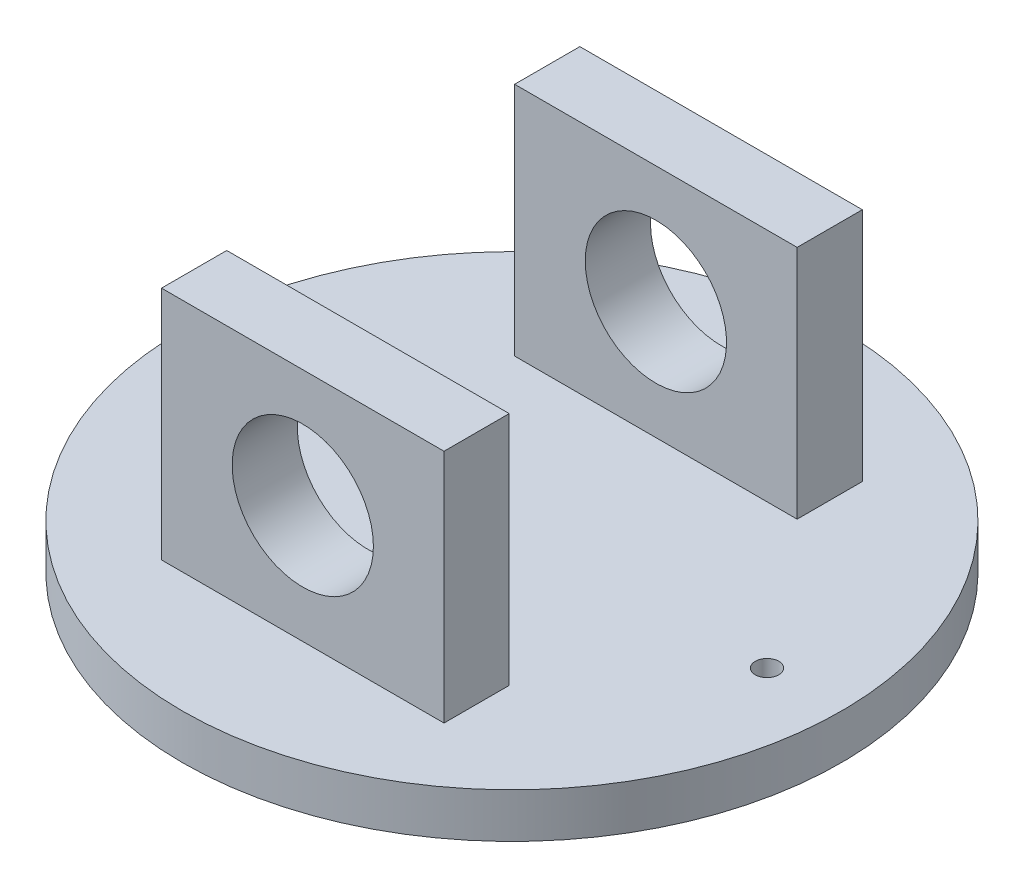
ISO-10303-21;
HEADER;
FILE_DESCRIPTION(('STEP AP214'),'2;1');
FILE_NAME('part.step','',(''),(''),'','','');
FILE_SCHEMA(('AUTOMOTIVE_DESIGN { 1 0 10303 214 1 1 1 1 }'));
ENDSEC;
DATA;
#1=APPLICATION_CONTEXT('core data for automotive mechanical design processes');
#2=APPLICATION_PROTOCOL_DEFINITION('international standard','automotive_design',2000,#1);
#3=PRODUCT_CONTEXT('',#1,'mechanical');
#4=PRODUCT('Part','Part','',(#3));
#5=PRODUCT_RELATED_PRODUCT_CATEGORY('part','',(#4));
#6=PRODUCT_DEFINITION_FORMATION('','',#4);
#7=PRODUCT_DEFINITION_CONTEXT('part definition',#1,'design');
#8=PRODUCT_DEFINITION('design','',#6,#7);
#9=PRODUCT_DEFINITION_SHAPE('','',#8);
#10=(LENGTH_UNIT() NAMED_UNIT(*) SI_UNIT(.MILLI.,.METRE.));
#11=(NAMED_UNIT(*) PLANE_ANGLE_UNIT() SI_UNIT($,.RADIAN.));
#12=(NAMED_UNIT(*) SI_UNIT($,.STERADIAN.) SOLID_ANGLE_UNIT());
#13=UNCERTAINTY_MEASURE_WITH_UNIT(LENGTH_MEASURE(1.E-05),#10,'distance_accuracy_value','');
#14=(GEOMETRIC_REPRESENTATION_CONTEXT(3) GLOBAL_UNCERTAINTY_ASSIGNED_CONTEXT((#13)) GLOBAL_UNIT_ASSIGNED_CONTEXT((#10,
#11,#12)) REPRESENTATION_CONTEXT('',''));
#15=CARTESIAN_POINT('',(0.,0.,0.));
#16=DIRECTION('',(0.,0.,1.));
#17=DIRECTION('',(1.,0.,0.));
#18=AXIS2_PLACEMENT_3D('',#15,#16,#17);
#19=CARTESIAN_POINT('',(0.,50.,0.));
#20=DIRECTION('',(0.,1.,0.));
#21=DIRECTION('',(0.,0.,1.));
#22=AXIS2_PLACEMENT_3D('',#19,#20,#21);
#23=PLANE('',#22);
#24=CARTESIAN_POINT('',(-108.37824513432,50.,0.));
#25=DIRECTION('',(0.,1.,0.));
#26=DIRECTION('',(0.,0.,1.));
#27=AXIS2_PLACEMENT_3D('',#24,#25,#26);
#28=CIRCLE('',#27,5.);
#29=CARTESIAN_POINT('',(-108.37824513432,50.,5.));
#30=VERTEX_POINT('',#29);
#31=EDGE_CURVE('E201',#30,#30,#28,.F.);
#32=ORIENTED_EDGE('',*,*,#31,.T.);
#33=EDGE_LOOP('',(#32));
#34=FACE_BOUND('',#33,.T.);
#35=CARTESIAN_POINT('',(108.37824513432,50.,0.));
#36=DIRECTION('',(0.,1.,0.));
#37=DIRECTION('',(0.,0.,1.));
#38=AXIS2_PLACEMENT_3D('',#35,#36,#37);
#39=CIRCLE('',#38,5.);
#40=CARTESIAN_POINT('',(108.37824513432,50.,5.));
#41=VERTEX_POINT('',#40);
#42=EDGE_CURVE('E200',#41,#41,#39,.T.);
#43=ORIENTED_EDGE('',*,*,#42,.F.);
#44=EDGE_LOOP('',(#43));
#45=FACE_BOUND('',#44,.T.);
#46=CARTESIAN_POINT('',(0.,50.,0.));
#47=DIRECTION('',(0.,1.,0.));
#48=DIRECTION('',(0.,0.,1.));
#49=AXIS2_PLACEMENT_3D('',#46,#47,#48);
#50=CIRCLE('',#49,139.999706488511);
#51=CARTESIAN_POINT('',(0.,50.,139.999706488511));
#52=VERTEX_POINT('',#51);
#53=EDGE_CURVE('E167',#52,#52,#50,.T.);
#54=ORIENTED_EDGE('',*,*,#53,.T.);
#55=EDGE_LOOP('',(#54));
#56=FACE_BOUND('',#55,.T.);
#57=DIRECTION('',(-1.,0.,0.));
#58=VECTOR('',#57,1.);
#59=CARTESIAN_POINT('',(-60.,50.,-88.85));
#60=LINE('',#59,#58);
#61=CARTESIAN_POINT('',(60.,50.,-88.85));
#62=VERTEX_POINT('',#61);
#63=CARTESIAN_POINT('',(-60.,50.,-88.85));
#64=VERTEX_POINT('',#63);
#65=EDGE_CURVE('E133',#62,#64,#60,.T.);
#66=ORIENTED_EDGE('',*,*,#65,.F.);
#67=DIRECTION('',(0.,0.,-1.));
#68=VECTOR('',#67,1.);
#69=CARTESIAN_POINT('',(60.,50.,-88.85));
#70=LINE('',#69,#68);
#71=CARTESIAN_POINT('',(60.,50.,-61.15));
#72=VERTEX_POINT('',#71);
#73=EDGE_CURVE('E130',#72,#62,#70,.T.);
#74=ORIENTED_EDGE('',*,*,#73,.F.);
#75=DIRECTION('',(1.,0.,0.));
#76=VECTOR('',#75,1.);
#77=CARTESIAN_POINT('',(-60.,50.,-61.15));
#78=LINE('',#77,#76);
#79=CARTESIAN_POINT('',(-60.,50.,-61.15));
#80=VERTEX_POINT('',#79);
#81=EDGE_CURVE('E148',#80,#72,#78,.T.);
#82=ORIENTED_EDGE('',*,*,#81,.F.);
#83=DIRECTION('',(0.,0.,1.));
#84=VECTOR('',#83,1.);
#85=CARTESIAN_POINT('',(-60.,50.,-88.85));
#86=LINE('',#85,#84);
#87=EDGE_CURVE('E156',#64,#80,#86,.T.);
#88=ORIENTED_EDGE('',*,*,#87,.F.);
#89=EDGE_LOOP('',(#66,#74,#82,#88));
#90=FACE_BOUND('',#89,.T.);
#91=DIRECTION('',(1.,0.,0.));
#92=VECTOR('',#91,1.);
#93=CARTESIAN_POINT('',(-60.,50.,88.85));
#94=LINE('',#93,#92);
#95=CARTESIAN_POINT('',(-60.,50.,88.85));
#96=VERTEX_POINT('',#95);
#97=CARTESIAN_POINT('',(60.,50.,88.85));
#98=VERTEX_POINT('',#97);
#99=EDGE_CURVE('E129',#96,#98,#94,.T.);
#100=ORIENTED_EDGE('',*,*,#99,.F.);
#101=DIRECTION('',(0.,0.,1.));
#102=VECTOR('',#101,1.);
#103=CARTESIAN_POINT('',(-60.,50.,88.85));
#104=LINE('',#103,#102);
#105=CARTESIAN_POINT('',(-60.,50.,61.15));
#106=VERTEX_POINT('',#105);
#107=EDGE_CURVE('E124',#106,#96,#104,.T.);
#108=ORIENTED_EDGE('',*,*,#107,.F.);
#109=DIRECTION('',(-1.,0.,0.));
#110=VECTOR('',#109,1.);
#111=CARTESIAN_POINT('',(-60.,50.,61.15));
#112=LINE('',#111,#110);
#113=CARTESIAN_POINT('',(60.,50.,61.15));
#114=VERTEX_POINT('',#113);
#115=EDGE_CURVE('E109',#114,#106,#112,.T.);
#116=ORIENTED_EDGE('',*,*,#115,.F.);
#117=DIRECTION('',(0.,0.,-1.));
#118=VECTOR('',#117,1.);
#119=CARTESIAN_POINT('',(60.,50.,88.85));
#120=LINE('',#119,#118);
#121=EDGE_CURVE('E117',#98,#114,#120,.T.);
#122=ORIENTED_EDGE('',*,*,#121,.F.);
#123=EDGE_LOOP('',(#100,#108,#116,#122));
#124=FACE_BOUND('',#123,.T.);
#125=ADVANCED_FACE('F41',(#34,#45,#56,#90,#124),#23,.T.);
#126=CARTESIAN_POINT('',(0.,50.,0.));
#127=DIRECTION('',(0.,-1.,0.));
#128=DIRECTION('',(0.,0.,-1.));
#129=AXIS2_PLACEMENT_3D('',#126,#127,#128);
#130=CYLINDRICAL_SURFACE('',#129,7.5);
#131=CARTESIAN_POINT('',(0.,25.,0.));
#132=DIRECTION('',(0.,1.,0.));
#133=DIRECTION('',(0.,0.,1.));
#134=AXIS2_PLACEMENT_3D('',#131,#132,#133);
#135=CIRCLE('',#134,7.5);
#136=CARTESIAN_POINT('',(0.,25.,7.5));
#137=VERTEX_POINT('',#136);
#138=EDGE_CURVE('E171',#137,#137,#135,.T.);
#139=ORIENTED_EDGE('',*,*,#138,.T.);
#140=EDGE_LOOP('',(#139));
#141=FACE_BOUND('',#140,.T.);
#142=CARTESIAN_POINT('',(0.,31.,0.));
#143=DIRECTION('',(0.,1.,0.));
#144=DIRECTION('',(0.,0.,1.));
#145=AXIS2_PLACEMENT_3D('',#142,#143,#144);
#146=CIRCLE('',#145,7.5);
#147=CARTESIAN_POINT('',(0.,31.,7.5));
#148=VERTEX_POINT('',#147);
#149=EDGE_CURVE('E180',#148,#148,#146,.T.);
#150=ORIENTED_EDGE('',*,*,#149,.F.);
#151=EDGE_LOOP('',(#150));
#152=FACE_BOUND('',#151,.T.);
#153=ADVANCED_FACE('F271',(#141,#152),#130,.T.);
#154=CARTESIAN_POINT('',(0.,25.,0.));
#155=DIRECTION('',(0.,-1.,0.));
#156=DIRECTION('',(0.,0.,-1.));
#157=AXIS2_PLACEMENT_3D('',#154,#155,#156);
#158=CYLINDRICAL_SURFACE('',#157,2.5);
#159=CARTESIAN_POINT('',(0.,25.,0.));
#160=DIRECTION('',(0.,1.,0.));
#161=DIRECTION('',(0.,0.,1.));
#162=AXIS2_PLACEMENT_3D('',#159,#160,#161);
#163=CIRCLE('',#162,2.5);
#164=CARTESIAN_POINT('',(0.,25.,2.5));
#165=VERTEX_POINT('',#164);
#166=EDGE_CURVE('E177',#165,#165,#163,.T.);
#167=ORIENTED_EDGE('',*,*,#166,.F.);
#168=EDGE_LOOP('',(#167));
#169=FACE_BOUND('',#168,.T.);
#170=CARTESIAN_POINT('',(0.,0.,0.));
#171=DIRECTION('',(0.,1.,0.));
#172=DIRECTION('',(0.,0.,1.));
#173=AXIS2_PLACEMENT_3D('',#170,#171,#172);
#174=CIRCLE('',#173,2.5);
#175=CARTESIAN_POINT('',(0.,0.,2.5));
#176=VERTEX_POINT('',#175);
#177=EDGE_CURVE('E176',#176,#176,#174,.T.);
#178=ORIENTED_EDGE('',*,*,#177,.T.);
#179=EDGE_LOOP('',(#178));
#180=FACE_BOUND('',#179,.T.);
#181=ADVANCED_FACE('F43',(#169,#180),#158,.T.);
#182=CARTESIAN_POINT('',(0.,0.,0.));
#183=DIRECTION('',(0.,1.,0.));
#184=DIRECTION('',(0.,0.,1.));
#185=AXIS2_PLACEMENT_3D('',#182,#183,#184);
#186=PLANE('',#185);
#187=ORIENTED_EDGE('',*,*,#177,.F.);
#188=EDGE_LOOP('',(#187));
#189=FACE_BOUND('',#188,.T.);
#190=ADVANCED_FACE('F287',(#189),#186,.F.);
#191=CARTESIAN_POINT('',(0.,25.,0.));
#192=DIRECTION('',(0.,1.,0.));
#193=DIRECTION('',(0.,0.,1.));
#194=AXIS2_PLACEMENT_3D('',#191,#192,#193);
#195=PLANE('',#194);
#196=ORIENTED_EDGE('',*,*,#166,.T.);
#197=EDGE_LOOP('',(#196));
#198=FACE_BOUND('',#197,.T.);
#199=ORIENTED_EDGE('',*,*,#138,.F.);
#200=EDGE_LOOP('',(#199));
#201=FACE_BOUND('',#200,.T.);
#202=ADVANCED_FACE('F285',(#198,#201),#195,.F.);
#203=CARTESIAN_POINT('',(0.,31.,0.));
#204=DIRECTION('',(0.,1.,0.));
#205=DIRECTION('',(0.,0.,1.));
#206=AXIS2_PLACEMENT_3D('',#203,#204,#205);
#207=CYLINDRICAL_SURFACE('',#206,139.999706488511);
#208=CARTESIAN_POINT('',(0.,31.,0.));
#209=DIRECTION('',(0.,1.,0.));
#210=DIRECTION('',(0.,0.,1.));
#211=AXIS2_PLACEMENT_3D('',#208,#209,#210);
#212=CIRCLE('',#211,139.999706488511);
#213=CARTESIAN_POINT('',(0.,31.,139.999706488511));
#214=VERTEX_POINT('',#213);
#215=EDGE_CURVE('E168',#214,#214,#212,.T.);
#216=ORIENTED_EDGE('',*,*,#215,.T.);
#217=EDGE_LOOP('',(#216));
#218=FACE_BOUND('',#217,.T.);
#219=ORIENTED_EDGE('',*,*,#53,.F.);
#220=EDGE_LOOP('',(#219));
#221=FACE_BOUND('',#220,.T.);
#222=ADVANCED_FACE('F283',(#218,#221),#207,.T.);
#223=CARTESIAN_POINT('',(0.,31.,0.));
#224=DIRECTION('',(0.,1.,0.));
#225=DIRECTION('',(0.,0.,1.));
#226=AXIS2_PLACEMENT_3D('',#223,#224,#225);
#227=PLANE('',#226);
#228=CARTESIAN_POINT('',(-108.37824513432,31.,0.));
#229=DIRECTION('',(0.,1.,0.));
#230=DIRECTION('',(0.,0.,1.));
#231=AXIS2_PLACEMENT_3D('',#228,#229,#230);
#232=CIRCLE('',#231,5.);
#233=CARTESIAN_POINT('',(-108.37824513432,31.,5.));
#234=VERTEX_POINT('',#233);
#235=EDGE_CURVE('E45',#234,#234,#232,.F.);
#236=ORIENTED_EDGE('',*,*,#235,.F.);
#237=EDGE_LOOP('',(#236));
#238=FACE_BOUND('',#237,.T.);
#239=CARTESIAN_POINT('',(108.37824513432,31.,0.));
#240=DIRECTION('',(0.,1.,0.));
#241=DIRECTION('',(0.,0.,1.));
#242=AXIS2_PLACEMENT_3D('',#239,#240,#241);
#243=CIRCLE('',#242,5.);
#244=CARTESIAN_POINT('',(108.37824513432,31.,5.));
#245=VERTEX_POINT('',#244);
#246=EDGE_CURVE('E198',#245,#245,#243,.T.);
#247=ORIENTED_EDGE('',*,*,#246,.T.);
#248=EDGE_LOOP('',(#247));
#249=FACE_BOUND('',#248,.T.);
#250=CARTESIAN_POINT('',(-14.9389382152815,31.,8.62500000000018));
#251=DIRECTION('',(0.,1.,0.));
#252=DIRECTION('',(0.,0.,1.));
#253=AXIS2_PLACEMENT_3D('',#250,#251,#252);
#254=CIRCLE('',#253,2.);
#255=CARTESIAN_POINT('',(-14.9389382152815,31.,10.6250000000002));
#256=VERTEX_POINT('',#255);
#257=EDGE_CURVE('E11',#256,#256,#254,.F.);
#258=ORIENTED_EDGE('',*,*,#257,.F.);
#259=EDGE_LOOP('',(#258));
#260=FACE_BOUND('',#259,.T.);
#261=CARTESIAN_POINT('',(-14.9389382152816,31.,-8.62499999999986));
#262=DIRECTION('',(0.,1.,0.));
#263=DIRECTION('',(0.,0.,1.));
#264=AXIS2_PLACEMENT_3D('',#261,#262,#263);
#265=CIRCLE('',#264,2.);
#266=CARTESIAN_POINT('',(-14.9389382152816,31.,-6.62499999999986));
#267=VERTEX_POINT('',#266);
#268=EDGE_CURVE('E50',#267,#267,#265,.F.);
#269=ORIENTED_EDGE('',*,*,#268,.F.);
#270=EDGE_LOOP('',(#269));
#271=FACE_BOUND('',#270,.T.);
#272=CARTESIAN_POINT('',(-1.20456106190088E-13,31.,-17.25));
#273=DIRECTION('',(0.,1.,0.));
#274=DIRECTION('',(0.,0.,1.));
#275=AXIS2_PLACEMENT_3D('',#272,#273,#274);
#276=CIRCLE('',#275,2.);
#277=CARTESIAN_POINT('',(-1.20456106190088E-13,31.,-15.25));
#278=VERTEX_POINT('',#277);
#279=EDGE_CURVE('E194',#278,#278,#276,.F.);
#280=ORIENTED_EDGE('',*,*,#279,.F.);
#281=EDGE_LOOP('',(#280));
#282=FACE_BOUND('',#281,.T.);
#283=CARTESIAN_POINT('',(14.9389382152815,31.,-8.62500000000007));
#284=DIRECTION('',(0.,1.,0.));
#285=DIRECTION('',(0.,0.,1.));
#286=AXIS2_PLACEMENT_3D('',#283,#284,#285);
#287=CIRCLE('',#286,2.);
#288=CARTESIAN_POINT('',(14.9389382152815,31.,-6.62500000000007));
#289=VERTEX_POINT('',#288);
#290=EDGE_CURVE('E191',#289,#289,#287,.F.);
#291=ORIENTED_EDGE('',*,*,#290,.F.);
#292=EDGE_LOOP('',(#291));
#293=FACE_BOUND('',#292,.T.);
#294=CARTESIAN_POINT('',(14.9389382152816,31.,8.62499999999997));
#295=DIRECTION('',(0.,1.,0.));
#296=DIRECTION('',(0.,0.,1.));
#297=AXIS2_PLACEMENT_3D('',#294,#295,#296);
#298=CIRCLE('',#297,2.);
#299=CARTESIAN_POINT('',(14.9389382152816,31.,10.625));
#300=VERTEX_POINT('',#299);
#301=EDGE_CURVE('E188',#300,#300,#298,.F.);
#302=ORIENTED_EDGE('',*,*,#301,.F.);
#303=EDGE_LOOP('',(#302));
#304=FACE_BOUND('',#303,.T.);
#305=CARTESIAN_POINT('',(0.,31.,17.25));
#306=DIRECTION('',(0.,1.,0.));
#307=DIRECTION('',(0.,0.,1.));
#308=AXIS2_PLACEMENT_3D('',#305,#306,#307);
#309=CIRCLE('',#308,2.);
#310=CARTESIAN_POINT('',(0.,31.,19.25));
#311=VERTEX_POINT('',#310);
#312=EDGE_CURVE('E185',#311,#311,#309,.F.);
#313=ORIENTED_EDGE('',*,*,#312,.F.);
#314=EDGE_LOOP('',(#313));
#315=FACE_BOUND('',#314,.T.);
#316=ORIENTED_EDGE('',*,*,#149,.T.);
#317=EDGE_LOOP('',(#316));
#318=FACE_BOUND('',#317,.T.);
#319=ORIENTED_EDGE('',*,*,#215,.F.);
#320=EDGE_LOOP('',(#319));
#321=FACE_BOUND('',#320,.T.);
#322=ADVANCED_FACE('F305',(#238,#249,#260,#271,#282,#293,#304,#315,#318,#321),#227,.F.);
#323=CARTESIAN_POINT('',(60.,150.,-88.85));
#324=DIRECTION('',(-1.,0.,0.));
#325=DIRECTION('',(0.,0.,1.));
#326=AXIS2_PLACEMENT_3D('',#323,#324,#325);
#327=PLANE('',#326);
#328=ORIENTED_EDGE('',*,*,#73,.T.);
#329=DIRECTION('',(0.,-1.,0.));
#330=VECTOR('',#329,1.);
#331=CARTESIAN_POINT('',(60.,150.,-88.85));
#332=LINE('',#331,#330);
#333=CARTESIAN_POINT('',(60.,150.,-88.85));
#334=VERTEX_POINT('',#333);
#335=EDGE_CURVE('E165',#334,#62,#332,.T.);
#336=ORIENTED_EDGE('',*,*,#335,.F.);
#337=DIRECTION('',(0.,0.,-1.));
#338=VECTOR('',#337,1.);
#339=CARTESIAN_POINT('',(60.,150.,-88.85));
#340=LINE('',#339,#338);
#341=CARTESIAN_POINT('',(60.,150.,-61.15));
#342=VERTEX_POINT('',#341);
#343=EDGE_CURVE('E144',#342,#334,#340,.T.);
#344=ORIENTED_EDGE('',*,*,#343,.F.);
#345=DIRECTION('',(0.,-1.,0.));
#346=VECTOR('',#345,1.);
#347=CARTESIAN_POINT('',(60.,150.,-61.15));
#348=LINE('',#347,#346);
#349=EDGE_CURVE('E153',#342,#72,#348,.T.);
#350=ORIENTED_EDGE('',*,*,#349,.T.);
#351=EDGE_LOOP('',(#328,#336,#344,#350));
#352=FACE_BOUND('',#351,.T.);
#353=ADVANCED_FACE('F307',(#352),#327,.F.);
#354=CARTESIAN_POINT('',(-60.,150.,-88.85));
#355=DIRECTION('',(0.,0.,1.));
#356=DIRECTION('',(1.,0.,0.));
#357=AXIS2_PLACEMENT_3D('',#354,#355,#356);
#358=PLANE('',#357);
#359=CARTESIAN_POINT('',(0.,100.,-88.85));
#360=DIRECTION('',(0.,0.,-1.));
#361=DIRECTION('',(-1.,0.,0.));
#362=AXIS2_PLACEMENT_3D('',#359,#360,#361);
#363=CIRCLE('',#362,30.);
#364=CARTESIAN_POINT('',(-30.,100.,-88.85));
#365=VERTEX_POINT('',#364);
#366=EDGE_CURVE('E230',#365,#365,#363,.T.);
#367=ORIENTED_EDGE('',*,*,#366,.F.);
#368=EDGE_LOOP('',(#367));
#369=FACE_BOUND('',#368,.T.);
#370=ORIENTED_EDGE('',*,*,#65,.T.);
#371=DIRECTION('',(0.,-1.,0.));
#372=VECTOR('',#371,1.);
#373=CARTESIAN_POINT('',(-60.,150.,-88.85));
#374=LINE('',#373,#372);
#375=CARTESIAN_POINT('',(-60.,150.,-88.85));
#376=VERTEX_POINT('',#375);
#377=EDGE_CURVE('E162',#376,#64,#374,.T.);
#378=ORIENTED_EDGE('',*,*,#377,.F.);
#379=DIRECTION('',(-1.,0.,0.));
#380=VECTOR('',#379,1.);
#381=CARTESIAN_POINT('',(-60.,150.,-88.85));
#382=LINE('',#381,#380);
#383=EDGE_CURVE('E147',#334,#376,#382,.T.);
#384=ORIENTED_EDGE('',*,*,#383,.F.);
#385=ORIENTED_EDGE('',*,*,#335,.T.);
#386=EDGE_LOOP('',(#370,#378,#384,#385));
#387=FACE_BOUND('',#386,.T.);
#388=ADVANCED_FACE('F322',(#369,#387),#358,.F.);
#389=CARTESIAN_POINT('',(-60.,150.,-88.85));
#390=DIRECTION('',(1.,0.,0.));
#391=DIRECTION('',(0.,0.,-1.));
#392=AXIS2_PLACEMENT_3D('',#389,#390,#391);
#393=PLANE('',#392);
#394=ORIENTED_EDGE('',*,*,#87,.T.);
#395=DIRECTION('',(0.,-1.,0.));
#396=VECTOR('',#395,1.);
#397=CARTESIAN_POINT('',(-60.,150.,-61.15));
#398=LINE('',#397,#396);
#399=CARTESIAN_POINT('',(-60.,150.,-61.15));
#400=VERTEX_POINT('',#399);
#401=EDGE_CURVE('E66',#400,#80,#398,.T.);
#402=ORIENTED_EDGE('',*,*,#401,.F.);
#403=DIRECTION('',(0.,0.,1.));
#404=VECTOR('',#403,1.);
#405=CARTESIAN_POINT('',(-60.,150.,-88.85));
#406=LINE('',#405,#404);
#407=EDGE_CURVE('E150',#376,#400,#406,.T.);
#408=ORIENTED_EDGE('',*,*,#407,.F.);
#409=ORIENTED_EDGE('',*,*,#377,.T.);
#410=EDGE_LOOP('',(#394,#402,#408,#409));
#411=FACE_BOUND('',#410,.T.);
#412=ADVANCED_FACE('F326',(#411),#393,.F.);
#413=CARTESIAN_POINT('',(-60.,150.,-61.15));
#414=DIRECTION('',(0.,0.,-1.));
#415=DIRECTION('',(-1.,0.,0.));
#416=AXIS2_PLACEMENT_3D('',#413,#414,#415);
#417=PLANE('',#416);
#418=CARTESIAN_POINT('',(0.,100.,-61.15));
#419=DIRECTION('',(0.,0.,-1.));
#420=DIRECTION('',(-1.,0.,0.));
#421=AXIS2_PLACEMENT_3D('',#418,#419,#420);
#422=CIRCLE('',#421,30.);
#423=CARTESIAN_POINT('',(-30.,100.,-61.15));
#424=VERTEX_POINT('',#423);
#425=EDGE_CURVE('E233',#424,#424,#422,.F.);
#426=ORIENTED_EDGE('',*,*,#425,.F.);
#427=EDGE_LOOP('',(#426));
#428=FACE_BOUND('',#427,.T.);
#429=ORIENTED_EDGE('',*,*,#81,.T.);
#430=ORIENTED_EDGE('',*,*,#349,.F.);
#431=DIRECTION('',(1.,0.,0.));
#432=VECTOR('',#431,1.);
#433=CARTESIAN_POINT('',(-60.,150.,-61.15));
#434=LINE('',#433,#432);
#435=EDGE_CURVE('E152',#400,#342,#434,.T.);
#436=ORIENTED_EDGE('',*,*,#435,.F.);
#437=ORIENTED_EDGE('',*,*,#401,.T.);
#438=EDGE_LOOP('',(#429,#430,#436,#437));
#439=FACE_BOUND('',#438,.T.);
#440=ADVANCED_FACE('F332',(#428,#439),#417,.F.);
#441=CARTESIAN_POINT('',(0.,150.,0.));
#442=DIRECTION('',(0.,1.,0.));
#443=DIRECTION('',(0.,0.,1.));
#444=AXIS2_PLACEMENT_3D('',#441,#442,#443);
#445=PLANE('',#444);
#446=ORIENTED_EDGE('',*,*,#343,.T.);
#447=ORIENTED_EDGE('',*,*,#383,.T.);
#448=ORIENTED_EDGE('',*,*,#407,.T.);
#449=ORIENTED_EDGE('',*,*,#435,.T.);
#450=EDGE_LOOP('',(#446,#447,#448,#449));
#451=FACE_BOUND('',#450,.T.);
#452=ADVANCED_FACE('F328',(#451),#445,.T.);
#453=CARTESIAN_POINT('',(-60.,150.,88.85));
#454=DIRECTION('',(1.,0.,0.));
#455=DIRECTION('',(0.,0.,-1.));
#456=AXIS2_PLACEMENT_3D('',#453,#454,#455);
#457=PLANE('',#456);
#458=ORIENTED_EDGE('',*,*,#107,.T.);
#459=DIRECTION('',(0.,-1.,0.));
#460=VECTOR('',#459,1.);
#461=CARTESIAN_POINT('',(-60.,150.,88.85));
#462=LINE('',#461,#460);
#463=CARTESIAN_POINT('',(-60.,150.,88.85));
#464=VERTEX_POINT('',#463);
#465=EDGE_CURVE('E242',#464,#96,#462,.T.);
#466=ORIENTED_EDGE('',*,*,#465,.F.);
#467=DIRECTION('',(0.,0.,1.));
#468=VECTOR('',#467,1.);
#469=CARTESIAN_POINT('',(-60.,150.,88.85));
#470=LINE('',#469,#468);
#471=CARTESIAN_POINT('',(-60.,150.,61.15));
#472=VERTEX_POINT('',#471);
#473=EDGE_CURVE('E118',#472,#464,#470,.T.);
#474=ORIENTED_EDGE('',*,*,#473,.F.);
#475=DIRECTION('',(0.,-1.,0.));
#476=VECTOR('',#475,1.);
#477=CARTESIAN_POINT('',(-60.,150.,61.15));
#478=LINE('',#477,#476);
#479=EDGE_CURVE('E112',#472,#106,#478,.T.);
#480=ORIENTED_EDGE('',*,*,#479,.T.);
#481=EDGE_LOOP('',(#458,#466,#474,#480));
#482=FACE_BOUND('',#481,.T.);
#483=ADVANCED_FACE('F122',(#482),#457,.F.);
#484=CARTESIAN_POINT('',(-60.,150.,88.85));
#485=DIRECTION('',(0.,0.,-1.));
#486=DIRECTION('',(-1.,0.,0.));
#487=AXIS2_PLACEMENT_3D('',#484,#485,#486);
#488=PLANE('',#487);
#489=CARTESIAN_POINT('',(0.,100.,88.85));
#490=DIRECTION('',(0.,0.,1.));
#491=DIRECTION('',(1.,0.,0.));
#492=AXIS2_PLACEMENT_3D('',#489,#490,#491);
#493=CIRCLE('',#492,30.);
#494=CARTESIAN_POINT('',(30.,100.,88.85));
#495=VERTEX_POINT('',#494);
#496=EDGE_CURVE('E239',#495,#495,#493,.T.);
#497=ORIENTED_EDGE('',*,*,#496,.F.);
#498=EDGE_LOOP('',(#497));
#499=FACE_BOUND('',#498,.T.);
#500=ORIENTED_EDGE('',*,*,#99,.T.);
#501=DIRECTION('',(0.,-1.,0.));
#502=VECTOR('',#501,1.);
#503=CARTESIAN_POINT('',(60.,150.,88.85));
#504=LINE('',#503,#502);
#505=CARTESIAN_POINT('',(60.,150.,88.85));
#506=VERTEX_POINT('',#505);
#507=EDGE_CURVE('E244',#506,#98,#504,.T.);
#508=ORIENTED_EDGE('',*,*,#507,.F.);
#509=DIRECTION('',(1.,0.,0.));
#510=VECTOR('',#509,1.);
#511=CARTESIAN_POINT('',(-60.,150.,88.85));
#512=LINE('',#511,#510);
#513=EDGE_CURVE('E141',#464,#506,#512,.T.);
#514=ORIENTED_EDGE('',*,*,#513,.F.);
#515=ORIENTED_EDGE('',*,*,#465,.T.);
#516=EDGE_LOOP('',(#500,#508,#514,#515));
#517=FACE_BOUND('',#516,.T.);
#518=ADVANCED_FACE('F252',(#499,#517),#488,.F.);
#519=CARTESIAN_POINT('',(60.,150.,88.85));
#520=DIRECTION('',(-1.,0.,0.));
#521=DIRECTION('',(0.,0.,1.));
#522=AXIS2_PLACEMENT_3D('',#519,#520,#521);
#523=PLANE('',#522);
#524=ORIENTED_EDGE('',*,*,#121,.T.);
#525=DIRECTION('',(0.,-1.,0.));
#526=VECTOR('',#525,1.);
#527=CARTESIAN_POINT('',(60.,150.,61.15));
#528=LINE('',#527,#526);
#529=CARTESIAN_POINT('',(60.,150.,61.15));
#530=VERTEX_POINT('',#529);
#531=EDGE_CURVE('E58',#530,#114,#528,.T.);
#532=ORIENTED_EDGE('',*,*,#531,.F.);
#533=DIRECTION('',(0.,0.,-1.));
#534=VECTOR('',#533,1.);
#535=CARTESIAN_POINT('',(60.,150.,88.85));
#536=LINE('',#535,#534);
#537=EDGE_CURVE('E139',#506,#530,#536,.T.);
#538=ORIENTED_EDGE('',*,*,#537,.F.);
#539=ORIENTED_EDGE('',*,*,#507,.T.);
#540=EDGE_LOOP('',(#524,#532,#538,#539));
#541=FACE_BOUND('',#540,.T.);
#542=ADVANCED_FACE('F248',(#541),#523,.F.);
#543=CARTESIAN_POINT('',(-60.,150.,61.15));
#544=DIRECTION('',(0.,0.,1.));
#545=DIRECTION('',(1.,0.,0.));
#546=AXIS2_PLACEMENT_3D('',#543,#544,#545);
#547=PLANE('',#546);
#548=CARTESIAN_POINT('',(0.,100.,61.15));
#549=DIRECTION('',(0.,0.,1.));
#550=DIRECTION('',(1.,0.,0.));
#551=AXIS2_PLACEMENT_3D('',#548,#549,#550);
#552=CIRCLE('',#551,30.);
#553=CARTESIAN_POINT('',(30.,100.,61.15));
#554=VERTEX_POINT('',#553);
#555=EDGE_CURVE('E236',#554,#554,#552,.F.);
#556=ORIENTED_EDGE('',*,*,#555,.F.);
#557=EDGE_LOOP('',(#556));
#558=FACE_BOUND('',#557,.T.);
#559=ORIENTED_EDGE('',*,*,#115,.T.);
#560=ORIENTED_EDGE('',*,*,#479,.F.);
#561=DIRECTION('',(-1.,0.,0.));
#562=VECTOR('',#561,1.);
#563=CARTESIAN_POINT('',(-60.,150.,61.15));
#564=LINE('',#563,#562);
#565=EDGE_CURVE('E127',#530,#472,#564,.T.);
#566=ORIENTED_EDGE('',*,*,#565,.F.);
#567=ORIENTED_EDGE('',*,*,#531,.T.);
#568=EDGE_LOOP('',(#559,#560,#566,#567));
#569=FACE_BOUND('',#568,.T.);
#570=ADVANCED_FACE('F111',(#558,#569),#547,.F.);
#571=CARTESIAN_POINT('',(0.,150.,0.));
#572=DIRECTION('',(0.,-1.,0.));
#573=DIRECTION('',(0.,0.,-1.));
#574=AXIS2_PLACEMENT_3D('',#571,#572,#573);
#575=PLANE('',#574);
#576=ORIENTED_EDGE('',*,*,#473,.T.);
#577=ORIENTED_EDGE('',*,*,#513,.T.);
#578=ORIENTED_EDGE('',*,*,#537,.T.);
#579=ORIENTED_EDGE('',*,*,#565,.T.);
#580=EDGE_LOOP('',(#576,#577,#578,#579));
#581=FACE_BOUND('',#580,.T.);
#582=ADVANCED_FACE('F254',(#581),#575,.F.);
#583=CARTESIAN_POINT('',(0.,100.,-140.000706488511));
#584=DIRECTION('',(0.,0.,1.));
#585=DIRECTION('',(1.,0.,0.));
#586=AXIS2_PLACEMENT_3D('',#583,#584,#585);
#587=CYLINDRICAL_SURFACE('',#586,30.);
#588=ORIENTED_EDGE('',*,*,#496,.T.);
#589=EDGE_LOOP('',(#588));
#590=FACE_BOUND('',#589,.T.);
#591=ORIENTED_EDGE('',*,*,#555,.T.);
#592=EDGE_LOOP('',(#591));
#593=FACE_BOUND('',#592,.T.);
#594=ADVANCED_FACE('F256',(#590,#593),#587,.F.);
#595=CARTESIAN_POINT('',(0.,100.,140.000706488511));
#596=DIRECTION('',(0.,0.,-1.));
#597=DIRECTION('',(-1.,0.,0.));
#598=AXIS2_PLACEMENT_3D('',#595,#596,#597);
#599=CYLINDRICAL_SURFACE('',#598,30.);
#600=ORIENTED_EDGE('',*,*,#366,.T.);
#601=EDGE_LOOP('',(#600));
#602=FACE_BOUND('',#601,.T.);
#603=ORIENTED_EDGE('',*,*,#425,.T.);
#604=EDGE_LOOP('',(#603));
#605=FACE_BOUND('',#604,.T.);
#606=ADVANCED_FACE('F263',(#602,#605),#599,.F.);
#607=CARTESIAN_POINT('',(0.,1.00000000000001,17.25));
#608=DIRECTION('',(0.,1.,0.));
#609=DIRECTION('',(0.,0.,1.));
#610=AXIS2_PLACEMENT_3D('',#607,#608,#609);
#611=CYLINDRICAL_SURFACE('',#610,2.);
#612=CARTESIAN_POINT('',(0.,1.00000000000001,17.25));
#613=DIRECTION('',(0.,-1.,0.));
#614=DIRECTION('',(0.,0.,-1.));
#615=AXIS2_PLACEMENT_3D('',#612,#613,#614);
#616=CIRCLE('',#615,2.);
#617=CARTESIAN_POINT('',(0.,1.00000000000001,15.25));
#618=VERTEX_POINT('',#617);
#619=EDGE_CURVE('E227',#618,#618,#616,.T.);
#620=ORIENTED_EDGE('',*,*,#619,.F.);
#621=EDGE_LOOP('',(#620));
#622=FACE_BOUND('',#621,.T.);
#623=ORIENTED_EDGE('',*,*,#312,.T.);
#624=EDGE_LOOP('',(#623));
#625=FACE_BOUND('',#624,.T.);
#626=ADVANCED_FACE('F405',(#622,#625),#611,.T.);
#627=CARTESIAN_POINT('',(0.,1.00000000000001,17.25));
#628=DIRECTION('',(0.,-1.,0.));
#629=DIRECTION('',(0.,0.,-1.));
#630=AXIS2_PLACEMENT_3D('',#627,#628,#629);
#631=PLANE('',#630);
#632=ORIENTED_EDGE('',*,*,#619,.T.);
#633=EDGE_LOOP('',(#632));
#634=FACE_BOUND('',#633,.T.);
#635=ADVANCED_FACE('F415',(#634),#631,.T.);
#636=CARTESIAN_POINT('',(14.9389382152816,1.00000000000001,8.62499999999997));
#637=DIRECTION('',(0.,1.,0.));
#638=DIRECTION('',(0.,0.,1.));
#639=AXIS2_PLACEMENT_3D('',#636,#637,#638);
#640=CYLINDRICAL_SURFACE('',#639,2.);
#641=CARTESIAN_POINT('',(14.9389382152816,1.00000000000001,8.62499999999997));
#642=DIRECTION('',(0.,-1.,0.));
#643=DIRECTION('',(0.,0.,-1.));
#644=AXIS2_PLACEMENT_3D('',#641,#642,#643);
#645=CIRCLE('',#644,2.);
#646=CARTESIAN_POINT('',(14.9389382152816,1.00000000000001,6.62499999999996));
#647=VERTEX_POINT('',#646);
#648=EDGE_CURVE('E224',#647,#647,#645,.T.);
#649=ORIENTED_EDGE('',*,*,#648,.F.);
#650=EDGE_LOOP('',(#649));
#651=FACE_BOUND('',#650,.T.);
#652=ORIENTED_EDGE('',*,*,#301,.T.);
#653=EDGE_LOOP('',(#652));
#654=FACE_BOUND('',#653,.T.);
#655=ADVANCED_FACE('F425',(#651,#654),#640,.T.);
#656=CARTESIAN_POINT('',(14.9389382152816,1.00000000000001,8.62499999999997));
#657=DIRECTION('',(0.,-1.,0.));
#658=DIRECTION('',(0.,0.,-1.));
#659=AXIS2_PLACEMENT_3D('',#656,#657,#658);
#660=PLANE('',#659);
#661=ORIENTED_EDGE('',*,*,#648,.T.);
#662=EDGE_LOOP('',(#661));
#663=FACE_BOUND('',#662,.T.);
#664=ADVANCED_FACE('F435',(#663),#660,.T.);
#665=CARTESIAN_POINT('',(14.9389382152815,1.00000000000001,-8.62500000000007));
#666=DIRECTION('',(0.,1.,0.));
#667=DIRECTION('',(0.,0.,1.));
#668=AXIS2_PLACEMENT_3D('',#665,#666,#667);
#669=CYLINDRICAL_SURFACE('',#668,2.);
#670=CARTESIAN_POINT('',(14.9389382152815,1.00000000000001,-8.62500000000007));
#671=DIRECTION('',(0.,-1.,0.));
#672=DIRECTION('',(0.,0.,-1.));
#673=AXIS2_PLACEMENT_3D('',#670,#671,#672);
#674=CIRCLE('',#673,2.);
#675=CARTESIAN_POINT('',(14.9389382152815,1.00000000000001,-10.6250000000001));
#676=VERTEX_POINT('',#675);
#677=EDGE_CURVE('E221',#676,#676,#674,.T.);
#678=ORIENTED_EDGE('',*,*,#677,.F.);
#679=EDGE_LOOP('',(#678));
#680=FACE_BOUND('',#679,.T.);
#681=ORIENTED_EDGE('',*,*,#290,.T.);
#682=EDGE_LOOP('',(#681));
#683=FACE_BOUND('',#682,.T.);
#684=ADVANCED_FACE('F445',(#680,#683),#669,.T.);
#685=CARTESIAN_POINT('',(14.9389382152815,1.00000000000001,-8.62500000000007));
#686=DIRECTION('',(0.,-1.,0.));
#687=DIRECTION('',(0.,0.,-1.));
#688=AXIS2_PLACEMENT_3D('',#685,#686,#687);
#689=PLANE('',#688);
#690=ORIENTED_EDGE('',*,*,#677,.T.);
#691=EDGE_LOOP('',(#690));
#692=FACE_BOUND('',#691,.T.);
#693=ADVANCED_FACE('F455',(#692),#689,.T.);
#694=CARTESIAN_POINT('',(-1.20456106190088E-13,1.00000000000001,-17.25));
#695=DIRECTION('',(0.,1.,0.));
#696=DIRECTION('',(0.,0.,1.));
#697=AXIS2_PLACEMENT_3D('',#694,#695,#696);
#698=CYLINDRICAL_SURFACE('',#697,2.);
#699=CARTESIAN_POINT('',(-1.20456106190088E-13,1.00000000000001,-17.25));
#700=DIRECTION('',(0.,-1.,0.));
#701=DIRECTION('',(0.,0.,-1.));
#702=AXIS2_PLACEMENT_3D('',#699,#700,#701);
#703=CIRCLE('',#702,2.);
#704=CARTESIAN_POINT('',(-1.20456106190088E-13,1.00000000000001,-19.25));
#705=VERTEX_POINT('',#704);
#706=EDGE_CURVE('E218',#705,#705,#703,.T.);
#707=ORIENTED_EDGE('',*,*,#706,.F.);
#708=EDGE_LOOP('',(#707));
#709=FACE_BOUND('',#708,.T.);
#710=ORIENTED_EDGE('',*,*,#279,.T.);
#711=EDGE_LOOP('',(#710));
#712=FACE_BOUND('',#711,.T.);
#713=ADVANCED_FACE('F465',(#709,#712),#698,.T.);
#714=CARTESIAN_POINT('',(-1.20456106190088E-13,1.00000000000001,-17.25));
#715=DIRECTION('',(0.,-1.,0.));
#716=DIRECTION('',(0.,0.,-1.));
#717=AXIS2_PLACEMENT_3D('',#714,#715,#716);
#718=PLANE('',#717);
#719=ORIENTED_EDGE('',*,*,#706,.T.);
#720=EDGE_LOOP('',(#719));
#721=FACE_BOUND('',#720,.T.);
#722=ADVANCED_FACE('F475',(#721),#718,.T.);
#723=CARTESIAN_POINT('',(-14.9389382152816,1.00000000000001,-8.62499999999986));
#724=DIRECTION('',(0.,1.,0.));
#725=DIRECTION('',(0.,0.,1.));
#726=AXIS2_PLACEMENT_3D('',#723,#724,#725);
#727=CYLINDRICAL_SURFACE('',#726,2.);
#728=CARTESIAN_POINT('',(-14.9389382152816,1.00000000000001,-8.62499999999986));
#729=DIRECTION('',(0.,-1.,0.));
#730=DIRECTION('',(0.,0.,-1.));
#731=AXIS2_PLACEMENT_3D('',#728,#729,#730);
#732=CIRCLE('',#731,2.);
#733=CARTESIAN_POINT('',(-14.9389382152816,1.00000000000001,-10.6249999999999));
#734=VERTEX_POINT('',#733);
#735=EDGE_CURVE('E215',#734,#734,#732,.T.);
#736=ORIENTED_EDGE('',*,*,#735,.F.);
#737=EDGE_LOOP('',(#736));
#738=FACE_BOUND('',#737,.T.);
#739=ORIENTED_EDGE('',*,*,#268,.T.);
#740=EDGE_LOOP('',(#739));
#741=FACE_BOUND('',#740,.T.);
#742=ADVANCED_FACE('F485',(#738,#741),#727,.T.);
#743=CARTESIAN_POINT('',(-14.9389382152816,1.00000000000001,-8.62499999999986));
#744=DIRECTION('',(0.,-1.,0.));
#745=DIRECTION('',(0.,0.,-1.));
#746=AXIS2_PLACEMENT_3D('',#743,#744,#745);
#747=PLANE('',#746);
#748=ORIENTED_EDGE('',*,*,#735,.T.);
#749=EDGE_LOOP('',(#748));
#750=FACE_BOUND('',#749,.T.);
#751=ADVANCED_FACE('F495',(#750),#747,.T.);
#752=CARTESIAN_POINT('',(-14.9389382152815,1.00000000000001,8.62500000000018));
#753=DIRECTION('',(0.,1.,0.));
#754=DIRECTION('',(0.,0.,1.));
#755=AXIS2_PLACEMENT_3D('',#752,#753,#754);
#756=CYLINDRICAL_SURFACE('',#755,2.);
#757=CARTESIAN_POINT('',(-14.9389382152815,1.00000000000001,8.62500000000018));
#758=DIRECTION('',(0.,-1.,0.));
#759=DIRECTION('',(0.,0.,-1.));
#760=AXIS2_PLACEMENT_3D('',#757,#758,#759);
#761=CIRCLE('',#760,2.);
#762=CARTESIAN_POINT('',(-14.9389382152815,1.00000000000001,6.62500000000017));
#763=VERTEX_POINT('',#762);
#764=EDGE_CURVE('E205',#763,#763,#761,.T.);
#765=ORIENTED_EDGE('',*,*,#764,.F.);
#766=EDGE_LOOP('',(#765));
#767=FACE_BOUND('',#766,.T.);
#768=ORIENTED_EDGE('',*,*,#257,.T.);
#769=EDGE_LOOP('',(#768));
#770=FACE_BOUND('',#769,.T.);
#771=ADVANCED_FACE('F505',(#767,#770),#756,.T.);
#772=CARTESIAN_POINT('',(-14.9389382152815,1.00000000000001,8.62500000000018));
#773=DIRECTION('',(0.,-1.,0.));
#774=DIRECTION('',(0.,0.,-1.));
#775=AXIS2_PLACEMENT_3D('',#772,#773,#774);
#776=PLANE('',#775);
#777=ORIENTED_EDGE('',*,*,#764,.T.);
#778=EDGE_LOOP('',(#777));
#779=FACE_BOUND('',#778,.T.);
#780=ADVANCED_FACE('F515',(#779),#776,.T.);
#781=CARTESIAN_POINT('',(108.37824513432,0.,0.));
#782=DIRECTION('',(0.,1.,0.));
#783=DIRECTION('',(0.,0.,1.));
#784=AXIS2_PLACEMENT_3D('',#781,#782,#783);
#785=CYLINDRICAL_SURFACE('',#784,5.);
#786=ORIENTED_EDGE('',*,*,#42,.T.);
#787=EDGE_LOOP('',(#786));
#788=FACE_BOUND('',#787,.T.);
#789=ORIENTED_EDGE('',*,*,#246,.F.);
#790=EDGE_LOOP('',(#789));
#791=FACE_BOUND('',#790,.T.);
#792=ADVANCED_FACE('F525',(#788,#791),#785,.F.);
#793=CARTESIAN_POINT('',(-108.37824513432,0.,0.));
#794=DIRECTION('',(0.,1.,0.));
#795=DIRECTION('',(0.,0.,1.));
#796=AXIS2_PLACEMENT_3D('',#793,#794,#795);
#797=CYLINDRICAL_SURFACE('',#796,5.);
#798=ORIENTED_EDGE('',*,*,#31,.F.);
#799=EDGE_LOOP('',(#798));
#800=FACE_BOUND('',#799,.T.);
#801=ORIENTED_EDGE('',*,*,#235,.T.);
#802=EDGE_LOOP('',(#801));
#803=FACE_BOUND('',#802,.T.);
#804=ADVANCED_FACE('F534',(#800,#803),#797,.F.);
#805=CLOSED_SHELL('',(#125,#153,#181,#190,#202,#222,#322,#353,#388,#412,#440,#452,#483,#518,
#542,#570,#582,#594,#606,#626,#635,#655,#664,#684,#693,#713,#722,#742,#751,#771,#780,#792,#804));
#806=MANIFOLD_SOLID_BREP('B2',#805);
#807=ADVANCED_BREP_SHAPE_REPRESENTATION('',(#18,#806),#14);
#808=SHAPE_DEFINITION_REPRESENTATION(#9,#807);
ENDSEC;
END-ISO-10303-21;
